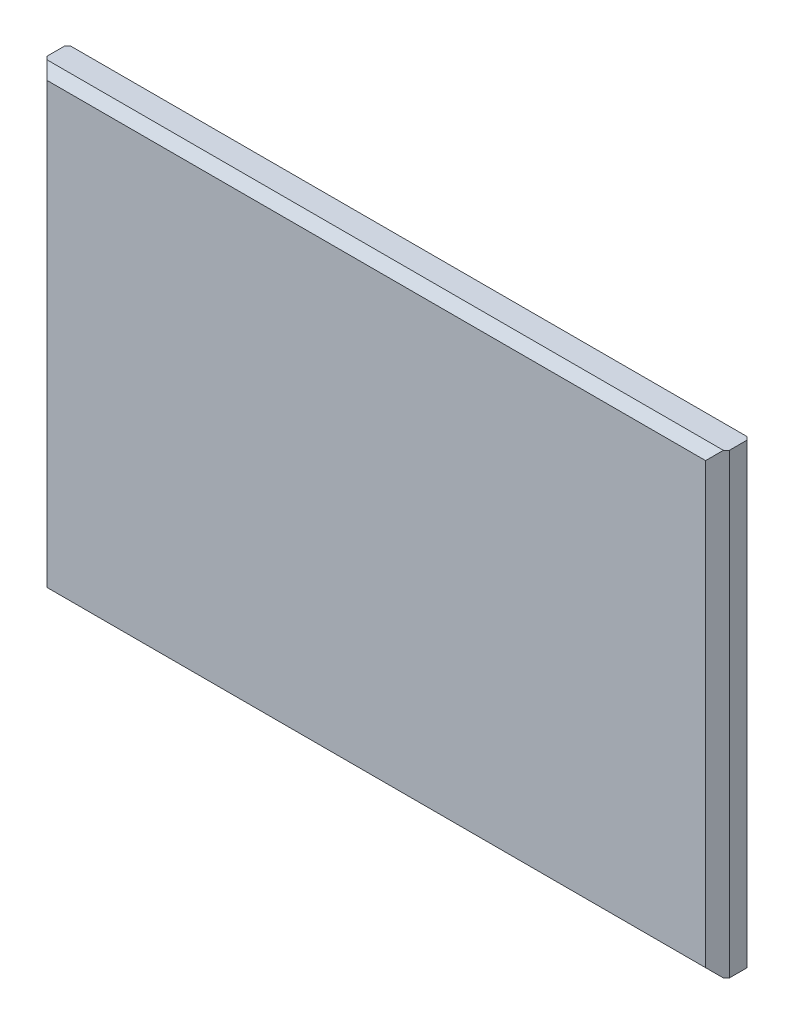
ISO-10303-21;
HEADER;
FILE_DESCRIPTION(('STEP AP214'),'2;1');
FILE_NAME('part.step','',(''),(''),'','','');
FILE_SCHEMA(('AUTOMOTIVE_DESIGN { 1 0 10303 214 1 1 1 1 }'));
ENDSEC;
DATA;
#1=APPLICATION_CONTEXT('core data for automotive mechanical design processes');
#2=APPLICATION_PROTOCOL_DEFINITION('international standard','automotive_design',2000,#1);
#3=PRODUCT_CONTEXT('',#1,'mechanical');
#4=PRODUCT('Part','Part','',(#3));
#5=PRODUCT_RELATED_PRODUCT_CATEGORY('part','',(#4));
#6=PRODUCT_DEFINITION_FORMATION('','',#4);
#7=PRODUCT_DEFINITION_CONTEXT('part definition',#1,'design');
#8=PRODUCT_DEFINITION('design','',#6,#7);
#9=PRODUCT_DEFINITION_SHAPE('','',#8);
#10=(LENGTH_UNIT() NAMED_UNIT(*) SI_UNIT(.MILLI.,.METRE.));
#11=(NAMED_UNIT(*) PLANE_ANGLE_UNIT() SI_UNIT($,.RADIAN.));
#12=(NAMED_UNIT(*) SI_UNIT($,.STERADIAN.) SOLID_ANGLE_UNIT());
#13=UNCERTAINTY_MEASURE_WITH_UNIT(LENGTH_MEASURE(1.E-05),#10,'distance_accuracy_value','');
#14=(GEOMETRIC_REPRESENTATION_CONTEXT(3) GLOBAL_UNCERTAINTY_ASSIGNED_CONTEXT((#13)) GLOBAL_UNIT_ASSIGNED_CONTEXT((#10,
#11,#12)) REPRESENTATION_CONTEXT('',''));
#15=CARTESIAN_POINT('',(0.,0.,0.));
#16=DIRECTION('',(0.,0.,1.));
#17=DIRECTION('',(1.,0.,0.));
#18=AXIS2_PLACEMENT_3D('',#15,#16,#17);
#19=CARTESIAN_POINT('',(14.605,9.779,1.778));
#20=DIRECTION('',(-1.,0.,0.));
#21=DIRECTION('',(0.,-1.,0.));
#22=AXIS2_PLACEMENT_3D('',#19,#20,#21);
#23=PLANE('',#22);
#24=DIRECTION('',(0.,0.,-1.));
#25=VECTOR('',#24,1.);
#26=CARTESIAN_POINT('',(14.605,9.779,1.778));
#27=LINE('',#26,#25);
#28=CARTESIAN_POINT('',(14.605,9.779,1.27));
#29=VERTEX_POINT('',#28);
#30=CARTESIAN_POINT('',(14.605,9.779,0.508000000000005));
#31=VERTEX_POINT('',#30);
#32=EDGE_CURVE('E157',#29,#31,#27,.T.);
#33=ORIENTED_EDGE('',*,*,#32,.F.);
#34=DIRECTION('',(0.,-1.,0.));
#35=VECTOR('',#34,1.);
#36=CARTESIAN_POINT('',(14.605,-9.398,1.27));
#37=LINE('',#36,#35);
#38=CARTESIAN_POINT('',(14.605,-9.779,1.26999999999999));
#39=VERTEX_POINT('',#38);
#40=EDGE_CURVE('E187',#29,#39,#37,.T.);
#41=ORIENTED_EDGE('',*,*,#40,.T.);
#42=DIRECTION('',(0.,0.,-1.));
#43=VECTOR('',#42,1.);
#44=CARTESIAN_POINT('',(14.605,-9.779,1.778));
#45=LINE('',#44,#43);
#46=CARTESIAN_POINT('',(14.605,-9.779,0.508000000000005));
#47=VERTEX_POINT('',#46);
#48=EDGE_CURVE('E231',#39,#47,#45,.T.);
#49=ORIENTED_EDGE('',*,*,#48,.T.);
#50=DIRECTION('',(0.,1.,0.));
#51=VECTOR('',#50,1.);
#52=CARTESIAN_POINT('',(14.605,9.779,0.508000000000005));
#53=LINE('',#52,#51);
#54=EDGE_CURVE('E184',#47,#31,#53,.T.);
#55=ORIENTED_EDGE('',*,*,#54,.T.);
#56=EDGE_LOOP('',(#33,#41,#49,#55));
#57=FACE_BOUND('',#56,.T.);
#58=ADVANCED_FACE('F33',(#57),#23,.F.);
#59=CARTESIAN_POINT('',(-14.605,9.779,1.778));
#60=DIRECTION('',(0.,-1.,0.));
#61=DIRECTION('',(0.,0.,-1.));
#62=AXIS2_PLACEMENT_3D('',#59,#60,#61);
#63=PLANE('',#62);
#64=DIRECTION('',(1.,0.,0.));
#65=VECTOR('',#64,1.);
#66=CARTESIAN_POINT('',(14.605,9.779,1.397));
#67=LINE('',#66,#65);
#68=CARTESIAN_POINT('',(-14.478,9.779,1.397));
#69=VERTEX_POINT('',#68);
#70=CARTESIAN_POINT('',(14.478,9.779,1.397));
#71=VERTEX_POINT('',#70);
#72=EDGE_CURVE('E166',#69,#71,#67,.T.);
#73=ORIENTED_EDGE('',*,*,#72,.T.);
#74=DIRECTION('',(0.707106781186548,0.,-0.707106781186548));
#75=VECTOR('',#74,1.);
#76=CARTESIAN_POINT('',(14.097,9.779,1.778));
#77=LINE('',#76,#75);
#78=EDGE_CURVE('E182',#71,#29,#77,.T.);
#79=ORIENTED_EDGE('',*,*,#78,.T.);
#80=ORIENTED_EDGE('',*,*,#32,.T.);
#81=DIRECTION('',(0.707106781186548,0.,0.707106781186548));
#82=VECTOR('',#81,1.);
#83=CARTESIAN_POINT('',(14.605,9.779,0.508000000000005));
#84=LINE('',#83,#82);
#85=CARTESIAN_POINT('',(14.478,9.779,0.380999999999999));
#86=VERTEX_POINT('',#85);
#87=EDGE_CURVE('E180',#31,#86,#84,.F.);
#88=ORIENTED_EDGE('',*,*,#87,.T.);
#89=DIRECTION('',(-1.,0.,0.));
#90=VECTOR('',#89,1.);
#91=CARTESIAN_POINT('',(-14.605,9.779,0.380999999999999));
#92=LINE('',#91,#90);
#93=CARTESIAN_POINT('',(-14.478,9.779,0.380999999999999));
#94=VERTEX_POINT('',#93);
#95=EDGE_CURVE('E148',#86,#94,#92,.T.);
#96=ORIENTED_EDGE('',*,*,#95,.T.);
#97=DIRECTION('',(0.707106781186548,0.,-0.707106781186548));
#98=VECTOR('',#97,1.);
#99=CARTESIAN_POINT('',(-14.605,9.779,0.508000000000005));
#100=LINE('',#99,#98);
#101=CARTESIAN_POINT('',(-14.605,9.779,0.508000000000005));
#102=VERTEX_POINT('',#101);
#103=EDGE_CURVE('E178',#94,#102,#100,.F.);
#104=ORIENTED_EDGE('',*,*,#103,.T.);
#105=DIRECTION('',(0.,0.,-1.));
#106=VECTOR('',#105,1.);
#107=CARTESIAN_POINT('',(-14.605,9.779,1.778));
#108=LINE('',#107,#106);
#109=CARTESIAN_POINT('',(-14.605,9.779,1.27));
#110=VERTEX_POINT('',#109);
#111=EDGE_CURVE('E210',#110,#102,#108,.T.);
#112=ORIENTED_EDGE('',*,*,#111,.F.);
#113=DIRECTION('',(0.707106781186547,0.,0.707106781186547));
#114=VECTOR('',#113,1.);
#115=CARTESIAN_POINT('',(-14.097,9.779,1.778));
#116=LINE('',#115,#114);
#117=EDGE_CURVE('E176',#110,#69,#116,.T.);
#118=ORIENTED_EDGE('',*,*,#117,.T.);
#119=EDGE_LOOP('',(#73,#79,#80,#88,#96,#104,#112,#118));
#120=FACE_BOUND('',#119,.T.);
#121=ADVANCED_FACE('F215',(#120),#63,.F.);
#122=CARTESIAN_POINT('',(-14.605,9.779,1.778));
#123=DIRECTION('',(1.,0.,0.));
#124=DIRECTION('',(0.,1.,0.));
#125=AXIS2_PLACEMENT_3D('',#122,#123,#124);
#126=PLANE('',#125);
#127=ORIENTED_EDGE('',*,*,#111,.T.);
#128=DIRECTION('',(0.,-1.,0.));
#129=VECTOR('',#128,1.);
#130=CARTESIAN_POINT('',(-14.605,9.779,0.508000000000005));
#131=LINE('',#130,#129);
#132=CARTESIAN_POINT('',(-14.605,-9.779,0.508000000000005));
#133=VERTEX_POINT('',#132);
#134=EDGE_CURVE('E11',#102,#133,#131,.T.);
#135=ORIENTED_EDGE('',*,*,#134,.T.);
#136=DIRECTION('',(0.,0.,-1.));
#137=VECTOR('',#136,1.);
#138=CARTESIAN_POINT('',(-14.605,-9.779,1.778));
#139=LINE('',#138,#137);
#140=CARTESIAN_POINT('',(-14.605,-9.779,1.27));
#141=VERTEX_POINT('',#140);
#142=EDGE_CURVE('E213',#141,#133,#139,.T.);
#143=ORIENTED_EDGE('',*,*,#142,.F.);
#144=DIRECTION('',(0.,1.,0.));
#145=VECTOR('',#144,1.);
#146=CARTESIAN_POINT('',(-14.605,9.398,1.27));
#147=LINE('',#146,#145);
#148=EDGE_CURVE('E41',#141,#110,#147,.T.);
#149=ORIENTED_EDGE('',*,*,#148,.T.);
#150=EDGE_LOOP('',(#127,#135,#143,#149));
#151=FACE_BOUND('',#150,.T.);
#152=ADVANCED_FACE('F209',(#151),#126,.F.);
#153=CARTESIAN_POINT('',(-14.605,-9.779,1.778));
#154=DIRECTION('',(0.,1.,0.));
#155=DIRECTION('',(0.,0.,1.));
#156=AXIS2_PLACEMENT_3D('',#153,#154,#155);
#157=PLANE('',#156);
#158=ORIENTED_EDGE('',*,*,#48,.F.);
#159=DIRECTION('',(-0.707106781186548,0.,0.707106781186548));
#160=VECTOR('',#159,1.);
#161=CARTESIAN_POINT('',(14.097,-9.779,1.778));
#162=LINE('',#161,#160);
#163=CARTESIAN_POINT('',(14.478,-9.779,1.397));
#164=VERTEX_POINT('',#163);
#165=EDGE_CURVE('E136',#39,#164,#162,.T.);
#166=ORIENTED_EDGE('',*,*,#165,.T.);
#167=DIRECTION('',(-1.,0.,0.));
#168=VECTOR('',#167,1.);
#169=CARTESIAN_POINT('',(-14.605,-9.779,1.397));
#170=LINE('',#169,#168);
#171=CARTESIAN_POINT('',(-14.478,-9.779,1.397));
#172=VERTEX_POINT('',#171);
#173=EDGE_CURVE('E155',#164,#172,#170,.T.);
#174=ORIENTED_EDGE('',*,*,#173,.T.);
#175=DIRECTION('',(-0.707106781186547,0.,-0.707106781186547));
#176=VECTOR('',#175,1.);
#177=CARTESIAN_POINT('',(-14.097,-9.779,1.778));
#178=LINE('',#177,#176);
#179=EDGE_CURVE('E130',#172,#141,#178,.T.);
#180=ORIENTED_EDGE('',*,*,#179,.T.);
#181=ORIENTED_EDGE('',*,*,#142,.T.);
#182=DIRECTION('',(-0.707106781186548,0.,0.707106781186548));
#183=VECTOR('',#182,1.);
#184=CARTESIAN_POINT('',(-14.605,-9.779,0.508000000000007));
#185=LINE('',#184,#183);
#186=CARTESIAN_POINT('',(-14.478,-9.779,0.380999999999999));
#187=VERTEX_POINT('',#186);
#188=EDGE_CURVE('E190',#133,#187,#185,.F.);
#189=ORIENTED_EDGE('',*,*,#188,.T.);
#190=DIRECTION('',(1.,0.,0.));
#191=VECTOR('',#190,1.);
#192=CARTESIAN_POINT('',(-14.605,-9.779,0.380999999999999));
#193=LINE('',#192,#191);
#194=CARTESIAN_POINT('',(14.478,-9.779,0.380999999999996));
#195=VERTEX_POINT('',#194);
#196=EDGE_CURVE('E152',#187,#195,#193,.T.);
#197=ORIENTED_EDGE('',*,*,#196,.T.);
#198=DIRECTION('',(-0.707106781186548,0.,-0.707106781186548));
#199=VECTOR('',#198,1.);
#200=CARTESIAN_POINT('',(14.605,-9.779,0.508000000000003));
#201=LINE('',#200,#199);
#202=EDGE_CURVE('E192',#195,#47,#201,.F.);
#203=ORIENTED_EDGE('',*,*,#202,.T.);
#204=EDGE_LOOP('',(#158,#166,#174,#180,#181,#189,#197,#203));
#205=FACE_BOUND('',#204,.T.);
#206=ADVANCED_FACE('F234',(#205),#157,.F.);
#207=CARTESIAN_POINT('',(0.,0.,1.778));
#208=DIRECTION('',(0.,0.,1.));
#209=DIRECTION('',(1.,0.,0.));
#210=AXIS2_PLACEMENT_3D('',#207,#208,#209);
#211=PLANE('',#210);
#212=DIRECTION('',(1.,0.,0.));
#213=VECTOR('',#212,1.);
#214=CARTESIAN_POINT('',(14.605,-9.398,1.778));
#215=LINE('',#214,#213);
#216=CARTESIAN_POINT('',(-14.097,-9.398,1.778));
#217=VERTEX_POINT('',#216);
#218=CARTESIAN_POINT('',(14.097,-9.398,1.778));
#219=VERTEX_POINT('',#218);
#220=EDGE_CURVE('E143',#217,#219,#215,.T.);
#221=ORIENTED_EDGE('',*,*,#220,.T.);
#222=DIRECTION('',(0.,1.,0.));
#223=VECTOR('',#222,1.);
#224=CARTESIAN_POINT('',(14.097,9.398,1.778));
#225=LINE('',#224,#223);
#226=CARTESIAN_POINT('',(14.097,9.398,1.778));
#227=VERTEX_POINT('',#226);
#228=EDGE_CURVE('E147',#219,#227,#225,.T.);
#229=ORIENTED_EDGE('',*,*,#228,.T.);
#230=DIRECTION('',(-1.,0.,0.));
#231=VECTOR('',#230,1.);
#232=CARTESIAN_POINT('',(-14.605,9.398,1.778));
#233=LINE('',#232,#231);
#234=CARTESIAN_POINT('',(-14.097,9.398,1.778));
#235=VERTEX_POINT('',#234);
#236=EDGE_CURVE('E146',#227,#235,#233,.T.);
#237=ORIENTED_EDGE('',*,*,#236,.T.);
#238=DIRECTION('',(0.,-1.,0.));
#239=VECTOR('',#238,1.);
#240=CARTESIAN_POINT('',(-14.097,-9.39799999999999,1.778));
#241=LINE('',#240,#239);
#242=EDGE_CURVE('E128',#235,#217,#241,.T.);
#243=ORIENTED_EDGE('',*,*,#242,.T.);
#244=EDGE_LOOP('',(#221,#229,#237,#243));
#245=FACE_BOUND('',#244,.T.);
#246=ADVANCED_FACE('F141',(#245),#211,.T.);
#247=CARTESIAN_POINT('',(0.,0.,0.));
#248=DIRECTION('',(0.,0.,1.));
#249=DIRECTION('',(1.,0.,0.));
#250=AXIS2_PLACEMENT_3D('',#247,#248,#249);
#251=PLANE('',#250);
#252=DIRECTION('',(1.,0.,0.));
#253=VECTOR('',#252,1.);
#254=CARTESIAN_POINT('',(0.,9.398,0.));
#255=LINE('',#254,#253);
#256=CARTESIAN_POINT('',(-14.097,9.398,0.));
#257=VERTEX_POINT('',#256);
#258=CARTESIAN_POINT('',(14.097,9.398,0.));
#259=VERTEX_POINT('',#258);
#260=EDGE_CURVE('E162',#257,#259,#255,.T.);
#261=ORIENTED_EDGE('',*,*,#260,.T.);
#262=DIRECTION('',(0.,-1.,0.));
#263=VECTOR('',#262,1.);
#264=CARTESIAN_POINT('',(14.097,0.,0.));
#265=LINE('',#264,#263);
#266=CARTESIAN_POINT('',(14.097,-9.398,0.));
#267=VERTEX_POINT('',#266);
#268=EDGE_CURVE('E55',#259,#267,#265,.T.);
#269=ORIENTED_EDGE('',*,*,#268,.T.);
#270=DIRECTION('',(-1.,0.,0.));
#271=VECTOR('',#270,1.);
#272=CARTESIAN_POINT('',(0.,-9.398,0.));
#273=LINE('',#272,#271);
#274=CARTESIAN_POINT('',(-14.097,-9.398,0.));
#275=VERTEX_POINT('',#274);
#276=EDGE_CURVE('E164',#267,#275,#273,.T.);
#277=ORIENTED_EDGE('',*,*,#276,.T.);
#278=DIRECTION('',(0.,1.,0.));
#279=VECTOR('',#278,1.);
#280=CARTESIAN_POINT('',(-14.097,0.,0.));
#281=LINE('',#280,#279);
#282=EDGE_CURVE('E200',#275,#257,#281,.T.);
#283=ORIENTED_EDGE('',*,*,#282,.T.);
#284=EDGE_LOOP('',(#261,#269,#277,#283));
#285=FACE_BOUND('',#284,.T.);
#286=ADVANCED_FACE('F251',(#285),#251,.F.);
#287=CARTESIAN_POINT('',(0.,-9.398,1.778));
#288=DIRECTION('',(0.,-0.707106781186548,0.707106781186548));
#289=DIRECTION('',(-1.,0.,0.));
#290=AXIS2_PLACEMENT_3D('',#287,#288,#289);
#291=PLANE('',#290);
#292=ORIENTED_EDGE('',*,*,#173,.F.);
#293=DIRECTION('',(-0.577350269189626,0.577350269189626,0.577350269189626));
#294=VECTOR('',#293,1.);
#295=CARTESIAN_POINT('',(9.398,-4.699,6.477));
#296=LINE('',#295,#294);
#297=EDGE_CURVE('E135',#164,#219,#296,.T.);
#298=ORIENTED_EDGE('',*,*,#297,.T.);
#299=ORIENTED_EDGE('',*,*,#220,.F.);
#300=DIRECTION('',(-0.577350269189626,-0.577350269189626,-0.577350269189626));
#301=VECTOR('',#300,1.);
#302=CARTESIAN_POINT('',(-9.39799999999999,-4.699,6.477));
#303=LINE('',#302,#301);
#304=EDGE_CURVE('E124',#217,#172,#303,.T.);
#305=ORIENTED_EDGE('',*,*,#304,.T.);
#306=EDGE_LOOP('',(#292,#298,#299,#305));
#307=FACE_BOUND('',#306,.T.);
#308=ADVANCED_FACE('F150',(#307),#291,.T.);
#309=CARTESIAN_POINT('',(-14.605,-9.779,0.380999999999999));
#310=DIRECTION('',(0.,0.707106781186548,0.707106781186548));
#311=DIRECTION('',(1.,0.,0.));
#312=AXIS2_PLACEMENT_3D('',#309,#310,#311);
#313=PLANE('',#312);
#314=ORIENTED_EDGE('',*,*,#276,.F.);
#315=DIRECTION('',(0.577350269189626,-0.577350269189626,0.577350269189626));
#316=VECTOR('',#315,1.);
#317=CARTESIAN_POINT('',(4.78366666666666,-0.0846666666666687,-9.31333333333333));
#318=LINE('',#317,#316);
#319=EDGE_CURVE('E204',#267,#195,#318,.T.);
#320=ORIENTED_EDGE('',*,*,#319,.T.);
#321=ORIENTED_EDGE('',*,*,#196,.F.);
#322=DIRECTION('',(0.577350269189626,0.577350269189626,-0.577350269189626));
#323=VECTOR('',#322,1.);
#324=CARTESIAN_POINT('',(-14.5203333333333,-9.82133333333334,0.423333333333335));
#325=LINE('',#324,#323);
#326=EDGE_CURVE('E48',#187,#275,#325,.T.);
#327=ORIENTED_EDGE('',*,*,#326,.T.);
#328=EDGE_LOOP('',(#314,#320,#321,#327));
#329=FACE_BOUND('',#328,.T.);
#330=ADVANCED_FACE('F247',(#329),#313,.F.);
#331=CARTESIAN_POINT('',(-14.605,9.779,0.380999999999999));
#332=DIRECTION('',(0.,-0.707106781186548,0.707106781186548));
#333=DIRECTION('',(-1.,0.,0.));
#334=AXIS2_PLACEMENT_3D('',#331,#332,#333);
#335=PLANE('',#334);
#336=ORIENTED_EDGE('',*,*,#95,.F.);
#337=DIRECTION('',(-0.577350269189626,-0.577350269189626,-0.577350269189626));
#338=VECTOR('',#337,1.);
#339=CARTESIAN_POINT('',(4.78366666666666,0.0846666666666704,-9.31333333333333));
#340=LINE('',#339,#338);
#341=EDGE_CURVE('E198',#86,#259,#340,.T.);
#342=ORIENTED_EDGE('',*,*,#341,.T.);
#343=ORIENTED_EDGE('',*,*,#260,.F.);
#344=DIRECTION('',(-0.577350269189626,0.577350269189626,0.577350269189626));
#345=VECTOR('',#344,1.);
#346=CARTESIAN_POINT('',(-14.5203333333333,9.82133333333334,0.423333333333335));
#347=LINE('',#346,#345);
#348=EDGE_CURVE('E196',#257,#94,#347,.T.);
#349=ORIENTED_EDGE('',*,*,#348,.T.);
#350=EDGE_LOOP('',(#336,#342,#343,#349));
#351=FACE_BOUND('',#350,.T.);
#352=ADVANCED_FACE('F242',(#351),#335,.F.);
#353=CARTESIAN_POINT('',(0.,9.398,1.778));
#354=DIRECTION('',(0.,0.707106781186548,0.707106781186548));
#355=DIRECTION('',(1.,0.,0.));
#356=AXIS2_PLACEMENT_3D('',#353,#354,#355);
#357=PLANE('',#356);
#358=ORIENTED_EDGE('',*,*,#236,.F.);
#359=DIRECTION('',(0.577350269189626,0.577350269189626,-0.577350269189626));
#360=VECTOR('',#359,1.);
#361=CARTESIAN_POINT('',(9.39799999999999,4.699,6.477));
#362=LINE('',#361,#360);
#363=EDGE_CURVE('E174',#227,#71,#362,.T.);
#364=ORIENTED_EDGE('',*,*,#363,.T.);
#365=ORIENTED_EDGE('',*,*,#72,.F.);
#366=DIRECTION('',(0.577350269189626,-0.577350269189626,0.577350269189626));
#367=VECTOR('',#366,1.);
#368=CARTESIAN_POINT('',(-9.398,4.699,6.477));
#369=LINE('',#368,#367);
#370=EDGE_CURVE('E172',#69,#235,#369,.T.);
#371=ORIENTED_EDGE('',*,*,#370,.T.);
#372=EDGE_LOOP('',(#358,#364,#365,#371));
#373=FACE_BOUND('',#372,.T.);
#374=ADVANCED_FACE('F220',(#373),#357,.T.);
#375=CARTESIAN_POINT('',(14.097,0.,1.778));
#376=DIRECTION('',(0.707106781186548,0.,0.707106781186548));
#377=DIRECTION('',(0.,-1.,0.));
#378=AXIS2_PLACEMENT_3D('',#375,#376,#377);
#379=PLANE('',#378);
#380=ORIENTED_EDGE('',*,*,#165,.F.);
#381=ORIENTED_EDGE('',*,*,#40,.F.);
#382=ORIENTED_EDGE('',*,*,#78,.F.);
#383=ORIENTED_EDGE('',*,*,#363,.F.);
#384=ORIENTED_EDGE('',*,*,#228,.F.);
#385=ORIENTED_EDGE('',*,*,#297,.F.);
#386=EDGE_LOOP('',(#380,#381,#382,#383,#384,#385));
#387=FACE_BOUND('',#386,.T.);
#388=ADVANCED_FACE('F227',(#387),#379,.T.);
#389=CARTESIAN_POINT('',(14.605,9.779,0.508000000000005));
#390=DIRECTION('',(-0.707106781186548,0.,0.707106781186548));
#391=DIRECTION('',(0.,1.,0.));
#392=AXIS2_PLACEMENT_3D('',#389,#390,#391);
#393=PLANE('',#392);
#394=ORIENTED_EDGE('',*,*,#319,.F.);
#395=ORIENTED_EDGE('',*,*,#268,.F.);
#396=ORIENTED_EDGE('',*,*,#341,.F.);
#397=ORIENTED_EDGE('',*,*,#87,.F.);
#398=ORIENTED_EDGE('',*,*,#54,.F.);
#399=ORIENTED_EDGE('',*,*,#202,.F.);
#400=EDGE_LOOP('',(#394,#395,#396,#397,#398,#399));
#401=FACE_BOUND('',#400,.T.);
#402=ADVANCED_FACE('F246',(#401),#393,.F.);
#403=CARTESIAN_POINT('',(-14.605,9.779,0.508000000000005));
#404=DIRECTION('',(0.707106781186548,0.,0.707106781186548));
#405=DIRECTION('',(0.,-1.,0.));
#406=AXIS2_PLACEMENT_3D('',#403,#404,#405);
#407=PLANE('',#406);
#408=ORIENTED_EDGE('',*,*,#348,.F.);
#409=ORIENTED_EDGE('',*,*,#282,.F.);
#410=ORIENTED_EDGE('',*,*,#326,.F.);
#411=ORIENTED_EDGE('',*,*,#188,.F.);
#412=ORIENTED_EDGE('',*,*,#134,.F.);
#413=ORIENTED_EDGE('',*,*,#103,.F.);
#414=EDGE_LOOP('',(#408,#409,#410,#411,#412,#413));
#415=FACE_BOUND('',#414,.T.);
#416=ADVANCED_FACE('F249',(#415),#407,.F.);
#417=CARTESIAN_POINT('',(-14.097,0.,1.778));
#418=DIRECTION('',(-0.707106781186547,0.,0.707106781186547));
#419=DIRECTION('',(0.,1.,0.));
#420=AXIS2_PLACEMENT_3D('',#417,#418,#419);
#421=PLANE('',#420);
#422=ORIENTED_EDGE('',*,*,#117,.F.);
#423=ORIENTED_EDGE('',*,*,#148,.F.);
#424=ORIENTED_EDGE('',*,*,#179,.F.);
#425=ORIENTED_EDGE('',*,*,#304,.F.);
#426=ORIENTED_EDGE('',*,*,#242,.F.);
#427=ORIENTED_EDGE('',*,*,#370,.F.);
#428=EDGE_LOOP('',(#422,#423,#424,#425,#426,#427));
#429=FACE_BOUND('',#428,.T.);
#430=ADVANCED_FACE('F35',(#429),#421,.T.);
#431=CLOSED_SHELL('',(#58,#121,#152,#206,#246,#286,#308,#330,#352,#374,#388,#402,#416,#430));
#432=MANIFOLD_SOLID_BREP('B2',#431);
#433=ADVANCED_BREP_SHAPE_REPRESENTATION('',(#18,#432),#14);
#434=SHAPE_DEFINITION_REPRESENTATION(#9,#433);
ENDSEC;
END-ISO-10303-21;
